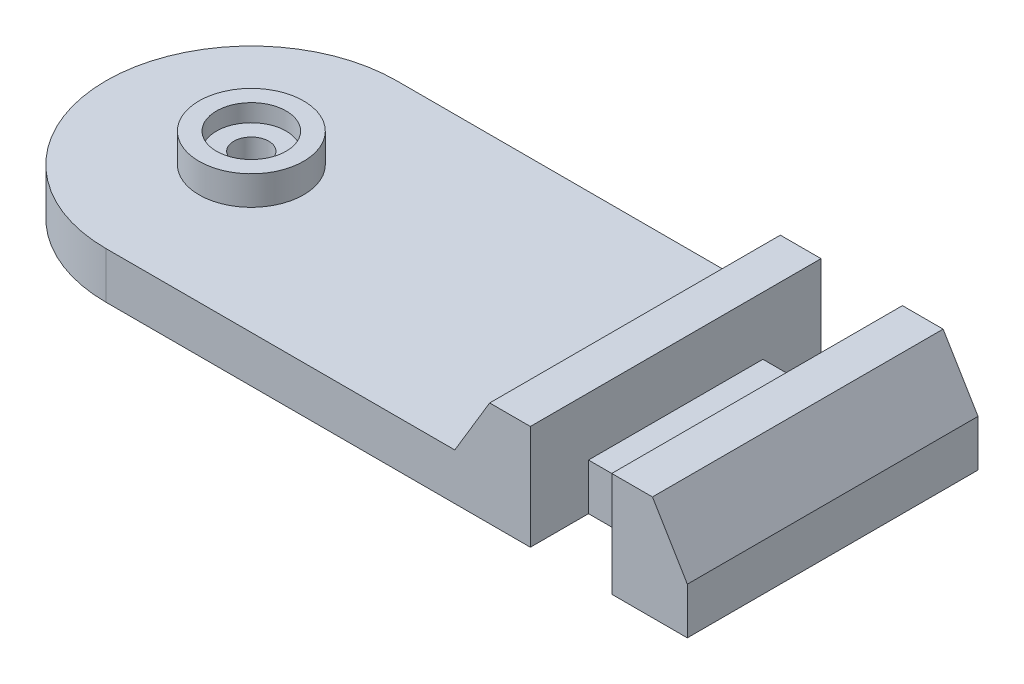
ISO-10303-21;
HEADER;
FILE_DESCRIPTION(('STEP AP214'),'2;1');
FILE_NAME('part.step','',(''),(''),'','','');
FILE_SCHEMA(('AUTOMOTIVE_DESIGN { 1 0 10303 214 1 1 1 1 }'));
ENDSEC;
DATA;
#1=APPLICATION_CONTEXT('core data for automotive mechanical design processes');
#2=APPLICATION_PROTOCOL_DEFINITION('international standard','automotive_design',2000,#1);
#3=PRODUCT_CONTEXT('',#1,'mechanical');
#4=PRODUCT('Part','Part','',(#3));
#5=PRODUCT_RELATED_PRODUCT_CATEGORY('part','',(#4));
#6=PRODUCT_DEFINITION_FORMATION('','',#4);
#7=PRODUCT_DEFINITION_CONTEXT('part definition',#1,'design');
#8=PRODUCT_DEFINITION('design','',#6,#7);
#9=PRODUCT_DEFINITION_SHAPE('','',#8);
#10=(LENGTH_UNIT() NAMED_UNIT(*) SI_UNIT(.MILLI.,.METRE.));
#11=(NAMED_UNIT(*) PLANE_ANGLE_UNIT() SI_UNIT($,.RADIAN.));
#12=(NAMED_UNIT(*) SI_UNIT($,.STERADIAN.) SOLID_ANGLE_UNIT());
#13=UNCERTAINTY_MEASURE_WITH_UNIT(LENGTH_MEASURE(1.E-05),#10,'distance_accuracy_value','');
#14=(GEOMETRIC_REPRESENTATION_CONTEXT(3) GLOBAL_UNCERTAINTY_ASSIGNED_CONTEXT((#13)) GLOBAL_UNIT_ASSIGNED_CONTEXT((#10,
#11,#12)) REPRESENTATION_CONTEXT('',''));
#15=CARTESIAN_POINT('',(0.,0.,0.));
#16=DIRECTION('',(0.,0.,1.));
#17=DIRECTION('',(1.,0.,0.));
#18=AXIS2_PLACEMENT_3D('',#15,#16,#17);
#19=CARTESIAN_POINT('',(0.,4.,12.5));
#20=DIRECTION('',(0.,0.,1.));
#21=DIRECTION('',(1.,0.,0.));
#22=AXIS2_PLACEMENT_3D('',#19,#20,#21);
#23=PLANE('',#22);
#24=DIRECTION('',(-1.,0.,0.));
#25=VECTOR('',#24,1.);
#26=CARTESIAN_POINT('',(0.,0.,12.5));
#27=LINE('',#26,#25);
#28=CARTESIAN_POINT('',(36.5,0.,12.5));
#29=VERTEX_POINT('',#28);
#30=CARTESIAN_POINT('',(0.,0.,12.5));
#31=VERTEX_POINT('',#30);
#32=EDGE_CURVE('E159',#29,#31,#27,.T.);
#33=ORIENTED_EDGE('',*,*,#32,.F.);
#34=DIRECTION('',(0.,-1.,0.));
#35=VECTOR('',#34,1.);
#36=CARTESIAN_POINT('',(36.5,9.,12.5));
#37=LINE('',#36,#35);
#38=CARTESIAN_POINT('',(36.5,9.,12.5));
#39=VERTEX_POINT('',#38);
#40=EDGE_CURVE('E143',#39,#29,#37,.T.);
#41=ORIENTED_EDGE('',*,*,#40,.F.);
#42=DIRECTION('',(-1.,0.,0.));
#43=VECTOR('',#42,1.);
#44=CARTESIAN_POINT('',(33.,9.,12.5));
#45=LINE('',#44,#43);
#46=CARTESIAN_POINT('',(33.,9.,12.5));
#47=VERTEX_POINT('',#46);
#48=EDGE_CURVE('E289',#39,#47,#45,.T.);
#49=ORIENTED_EDGE('',*,*,#48,.T.);
#50=DIRECTION('',(-0.514495755427527,-0.857492925712544,0.));
#51=VECTOR('',#50,1.);
#52=CARTESIAN_POINT('',(33.,9.,12.5));
#53=LINE('',#52,#51);
#54=CARTESIAN_POINT('',(30.,4.,12.5));
#55=VERTEX_POINT('',#54);
#56=EDGE_CURVE('E284',#47,#55,#53,.T.);
#57=ORIENTED_EDGE('',*,*,#56,.T.);
#58=DIRECTION('',(-1.,0.,0.));
#59=VECTOR('',#58,1.);
#60=CARTESIAN_POINT('',(0.,4.,12.5));
#61=LINE('',#60,#59);
#62=CARTESIAN_POINT('',(0.,4.,12.5));
#63=VERTEX_POINT('',#62);
#64=EDGE_CURVE('E190',#55,#63,#61,.T.);
#65=ORIENTED_EDGE('',*,*,#64,.T.);
#66=DIRECTION('',(0.,-1.,0.));
#67=VECTOR('',#66,1.);
#68=CARTESIAN_POINT('',(0.,4.,12.5));
#69=LINE('',#68,#67);
#70=EDGE_CURVE('E167',#63,#31,#69,.T.);
#71=ORIENTED_EDGE('',*,*,#70,.T.);
#72=EDGE_LOOP('',(#33,#41,#49,#57,#65,#71));
#73=FACE_BOUND('',#72,.T.);
#74=ADVANCED_FACE('F37',(#73),#23,.T.);
#75=CARTESIAN_POINT('',(0.,4.,-12.5));
#76=DIRECTION('',(0.,0.,-1.));
#77=DIRECTION('',(-1.,0.,0.));
#78=AXIS2_PLACEMENT_3D('',#75,#76,#77);
#79=PLANE('',#78);
#80=DIRECTION('',(0.,-1.,0.));
#81=VECTOR('',#80,1.);
#82=CARTESIAN_POINT('',(36.5,9.,-12.5));
#83=LINE('',#82,#81);
#84=CARTESIAN_POINT('',(36.5,9.,-12.5));
#85=VERTEX_POINT('',#84);
#86=CARTESIAN_POINT('',(36.5,0.,-12.5));
#87=VERTEX_POINT('',#86);
#88=EDGE_CURVE('E60',#85,#87,#83,.T.);
#89=ORIENTED_EDGE('',*,*,#88,.T.);
#90=DIRECTION('',(1.,0.,0.));
#91=VECTOR('',#90,1.);
#92=CARTESIAN_POINT('',(0.,0.,-12.5));
#93=LINE('',#92,#91);
#94=CARTESIAN_POINT('',(0.,0.,-12.5));
#95=VERTEX_POINT('',#94);
#96=EDGE_CURVE('E182',#95,#87,#93,.T.);
#97=ORIENTED_EDGE('',*,*,#96,.F.);
#98=DIRECTION('',(0.,-1.,0.));
#99=VECTOR('',#98,1.);
#100=CARTESIAN_POINT('',(0.,4.,-12.5));
#101=LINE('',#100,#99);
#102=CARTESIAN_POINT('',(0.,4.,-12.5));
#103=VERTEX_POINT('',#102);
#104=EDGE_CURVE('E192',#103,#95,#101,.T.);
#105=ORIENTED_EDGE('',*,*,#104,.F.);
#106=DIRECTION('',(1.,0.,0.));
#107=VECTOR('',#106,1.);
#108=CARTESIAN_POINT('',(0.,4.,-12.5));
#109=LINE('',#108,#107);
#110=CARTESIAN_POINT('',(30.,4.,-12.5));
#111=VERTEX_POINT('',#110);
#112=EDGE_CURVE('E230',#103,#111,#109,.T.);
#113=ORIENTED_EDGE('',*,*,#112,.T.);
#114=DIRECTION('',(-0.514495755427527,-0.857492925712544,0.));
#115=VECTOR('',#114,1.);
#116=CARTESIAN_POINT('',(33.,9.,-12.5));
#117=LINE('',#116,#115);
#118=CARTESIAN_POINT('',(33.,9.,-12.5));
#119=VERTEX_POINT('',#118);
#120=EDGE_CURVE('E293',#119,#111,#117,.T.);
#121=ORIENTED_EDGE('',*,*,#120,.F.);
#122=DIRECTION('',(-1.,0.,0.));
#123=VECTOR('',#122,1.);
#124=CARTESIAN_POINT('',(33.,9.,-12.5));
#125=LINE('',#124,#123);
#126=EDGE_CURVE('E252',#85,#119,#125,.T.);
#127=ORIENTED_EDGE('',*,*,#126,.F.);
#128=EDGE_LOOP('',(#89,#97,#105,#113,#121,#127));
#129=FACE_BOUND('',#128,.T.);
#130=ADVANCED_FACE('F249',(#129),#79,.T.);
#131=CARTESIAN_POINT('',(33.,9.,-33.1155281280883));
#132=DIRECTION('',(0.,1.,0.));
#133=DIRECTION('',(0.,0.,1.));
#134=AXIS2_PLACEMENT_3D('',#131,#132,#133);
#135=PLANE('',#134);
#136=DIRECTION('',(0.,0.,1.));
#137=VECTOR('',#136,1.);
#138=CARTESIAN_POINT('',(43.5,9.,-12.5));
#139=LINE('',#138,#137);
#140=CARTESIAN_POINT('',(43.5,9.,-12.5));
#141=VERTEX_POINT('',#140);
#142=CARTESIAN_POINT('',(43.5,9.,12.5));
#143=VERTEX_POINT('',#142);
#144=EDGE_CURVE('E253',#141,#143,#139,.T.);
#145=ORIENTED_EDGE('',*,*,#144,.T.);
#146=CARTESIAN_POINT('',(47.,9.,12.5));
#147=VERTEX_POINT('',#146);
#148=EDGE_CURVE('E287',#147,#143,#45,.T.);
#149=ORIENTED_EDGE('',*,*,#148,.F.);
#150=DIRECTION('',(0.,0.,1.));
#151=VECTOR('',#150,1.);
#152=CARTESIAN_POINT('',(47.,9.,-33.1155281280883));
#153=LINE('',#152,#151);
#154=CARTESIAN_POINT('',(47.,9.,-12.5));
#155=VERTEX_POINT('',#154);
#156=EDGE_CURVE('E225',#155,#147,#153,.T.);
#157=ORIENTED_EDGE('',*,*,#156,.F.);
#158=EDGE_CURVE('E222',#155,#141,#125,.T.);
#159=ORIENTED_EDGE('',*,*,#158,.T.);
#160=EDGE_LOOP('',(#145,#149,#157,#159));
#161=FACE_BOUND('',#160,.T.);
#162=ADVANCED_FACE('F327',(#161),#135,.T.);
#163=DIRECTION('',(0.,1.,0.));
#164=VECTOR('',#163,1.);
#165=CARTESIAN_POINT('',(43.5,9.,12.5));
#166=LINE('',#165,#164);
#167=CARTESIAN_POINT('',(43.5,0.,12.5));
#168=VERTEX_POINT('',#167);
#169=EDGE_CURVE('E153',#168,#143,#166,.T.);
#170=ORIENTED_EDGE('',*,*,#169,.F.);
#171=CARTESIAN_POINT('',(50.,0.,12.5));
#172=VERTEX_POINT('',#171);
#173=EDGE_CURVE('E169',#172,#168,#27,.T.);
#174=ORIENTED_EDGE('',*,*,#173,.F.);
#175=DIRECTION('',(0.,-1.,0.));
#176=VECTOR('',#175,1.);
#177=CARTESIAN_POINT('',(50.,4.,12.5));
#178=LINE('',#177,#176);
#179=CARTESIAN_POINT('',(50.,4.,12.5));
#180=VERTEX_POINT('',#179);
#181=EDGE_CURVE('E45',#180,#172,#178,.T.);
#182=ORIENTED_EDGE('',*,*,#181,.F.);
#183=DIRECTION('',(-0.514495755427527,0.857492925712544,0.));
#184=VECTOR('',#183,1.);
#185=CARTESIAN_POINT('',(47.,9.,12.5));
#186=LINE('',#185,#184);
#187=EDGE_CURVE('E229',#180,#147,#186,.T.);
#188=ORIENTED_EDGE('',*,*,#187,.T.);
#189=ORIENTED_EDGE('',*,*,#148,.T.);
#190=EDGE_LOOP('',(#170,#174,#182,#188,#189));
#191=FACE_BOUND('',#190,.T.);
#192=ADVANCED_FACE('F208',(#191),#23,.T.);
#193=CARTESIAN_POINT('',(50.,4.,0.));
#194=DIRECTION('',(1.,0.,0.));
#195=DIRECTION('',(0.,0.,-1.));
#196=AXIS2_PLACEMENT_3D('',#193,#194,#195);
#197=PLANE('',#196);
#198=DIRECTION('',(0.,0.,1.));
#199=VECTOR('',#198,1.);
#200=CARTESIAN_POINT('',(50.,0.,0.));
#201=LINE('',#200,#199);
#202=CARTESIAN_POINT('',(50.,0.,-12.5));
#203=VERTEX_POINT('',#202);
#204=EDGE_CURVE('E173',#203,#172,#201,.T.);
#205=ORIENTED_EDGE('',*,*,#204,.F.);
#206=DIRECTION('',(0.,-1.,0.));
#207=VECTOR('',#206,1.);
#208=CARTESIAN_POINT('',(50.,4.,-12.5));
#209=LINE('',#208,#207);
#210=CARTESIAN_POINT('',(50.,4.,-12.5));
#211=VERTEX_POINT('',#210);
#212=EDGE_CURVE('E195',#211,#203,#209,.T.);
#213=ORIENTED_EDGE('',*,*,#212,.F.);
#214=DIRECTION('',(0.,0.,1.));
#215=VECTOR('',#214,1.);
#216=CARTESIAN_POINT('',(50.,4.,0.));
#217=LINE('',#216,#215);
#218=EDGE_CURVE('E205',#211,#180,#217,.T.);
#219=ORIENTED_EDGE('',*,*,#218,.T.);
#220=ORIENTED_EDGE('',*,*,#181,.T.);
#221=EDGE_LOOP('',(#205,#213,#219,#220));
#222=FACE_BOUND('',#221,.T.);
#223=ADVANCED_FACE('F202',(#222),#197,.T.);
#224=CARTESIAN_POINT('',(43.5,0.,-12.5));
#225=VERTEX_POINT('',#224);
#226=EDGE_CURVE('E181',#225,#203,#93,.T.);
#227=ORIENTED_EDGE('',*,*,#226,.F.);
#228=DIRECTION('',(0.,1.,0.));
#229=VECTOR('',#228,1.);
#230=CARTESIAN_POINT('',(43.5,9.,-12.5));
#231=LINE('',#230,#229);
#232=EDGE_CURVE('E152',#225,#141,#231,.T.);
#233=ORIENTED_EDGE('',*,*,#232,.T.);
#234=ORIENTED_EDGE('',*,*,#158,.F.);
#235=DIRECTION('',(-0.514495755427527,0.857492925712544,0.));
#236=VECTOR('',#235,1.);
#237=CARTESIAN_POINT('',(47.,9.,-12.5));
#238=LINE('',#237,#236);
#239=EDGE_CURVE('E220',#211,#155,#238,.T.);
#240=ORIENTED_EDGE('',*,*,#239,.F.);
#241=ORIENTED_EDGE('',*,*,#212,.T.);
#242=EDGE_LOOP('',(#227,#233,#234,#240,#241));
#243=FACE_BOUND('',#242,.T.);
#244=ADVANCED_FACE('F218',(#243),#79,.T.);
#245=CARTESIAN_POINT('',(0.,4.,0.));
#246=DIRECTION('',(0.,-1.,0.));
#247=DIRECTION('',(0.,0.,-1.));
#248=AXIS2_PLACEMENT_3D('',#245,#246,#247);
#249=CYLINDRICAL_SURFACE('',#248,12.5);
#250=CARTESIAN_POINT('',(0.,0.,0.));
#251=DIRECTION('',(0.,1.,0.));
#252=DIRECTION('',(0.,0.,1.));
#253=AXIS2_PLACEMENT_3D('',#250,#251,#252);
#254=CIRCLE('',#253,12.5);
#255=EDGE_CURVE('E185',#95,#31,#254,.T.);
#256=ORIENTED_EDGE('',*,*,#255,.T.);
#257=ORIENTED_EDGE('',*,*,#70,.F.);
#258=CARTESIAN_POINT('',(0.,4.,0.));
#259=DIRECTION('',(0.,1.,0.));
#260=DIRECTION('',(0.,0.,1.));
#261=AXIS2_PLACEMENT_3D('',#258,#259,#260);
#262=CIRCLE('',#261,12.5);
#263=EDGE_CURVE('E193',#103,#63,#262,.T.);
#264=ORIENTED_EDGE('',*,*,#263,.F.);
#265=ORIENTED_EDGE('',*,*,#104,.T.);
#266=EDGE_LOOP('',(#256,#257,#264,#265));
#267=FACE_BOUND('',#266,.T.);
#268=ADVANCED_FACE('F245',(#267),#249,.T.);
#269=CARTESIAN_POINT('',(40.,4.,0.));
#270=DIRECTION('',(0.,-1.,0.));
#271=DIRECTION('',(0.,0.,-1.));
#272=AXIS2_PLACEMENT_3D('',#269,#270,#271);
#273=CYLINDRICAL_SURFACE('',#272,1.5);
#274=CARTESIAN_POINT('',(40.,4.,0.));
#275=DIRECTION('',(0.,-1.,0.));
#276=DIRECTION('',(0.,0.,-1.));
#277=AXIS2_PLACEMENT_3D('',#274,#275,#276);
#278=CIRCLE('',#277,1.5);
#279=CARTESIAN_POINT('',(40.,4.,-1.5));
#280=VERTEX_POINT('',#279);
#281=EDGE_CURVE('E277',#280,#280,#278,.T.);
#282=ORIENTED_EDGE('',*,*,#281,.F.);
#283=EDGE_LOOP('',(#282));
#284=FACE_BOUND('',#283,.T.);
#285=CARTESIAN_POINT('',(40.,0.,0.));
#286=DIRECTION('',(0.,1.,0.));
#287=DIRECTION('',(0.,0.,1.));
#288=AXIS2_PLACEMENT_3D('',#285,#286,#287);
#289=CIRCLE('',#288,1.5);
#290=CARTESIAN_POINT('',(40.,0.,1.5));
#291=VERTEX_POINT('',#290);
#292=EDGE_CURVE('E170',#291,#291,#289,.T.);
#293=ORIENTED_EDGE('',*,*,#292,.F.);
#294=EDGE_LOOP('',(#293));
#295=FACE_BOUND('',#294,.T.);
#296=ADVANCED_FACE('F39',(#284,#295),#273,.F.);
#297=CARTESIAN_POINT('',(0.,4.,0.));
#298=DIRECTION('',(0.,-1.,0.));
#299=DIRECTION('',(0.,0.,-1.));
#300=AXIS2_PLACEMENT_3D('',#297,#298,#299);
#301=CYLINDRICAL_SURFACE('',#300,1.5);
#302=CARTESIAN_POINT('',(0.,0.,0.));
#303=DIRECTION('',(0.,1.,0.));
#304=DIRECTION('',(0.,0.,1.));
#305=AXIS2_PLACEMENT_3D('',#302,#303,#304);
#306=CIRCLE('',#305,1.5);
#307=CARTESIAN_POINT('',(0.,0.,1.5));
#308=VERTEX_POINT('',#307);
#309=EDGE_CURVE('E187',#308,#308,#306,.T.);
#310=ORIENTED_EDGE('',*,*,#309,.F.);
#311=EDGE_LOOP('',(#310));
#312=FACE_BOUND('',#311,.T.);
#313=CARTESIAN_POINT('',(0.,5.,0.));
#314=DIRECTION('',(0.,1.,0.));
#315=DIRECTION('',(0.,0.,1.));
#316=AXIS2_PLACEMENT_3D('',#313,#314,#315);
#317=CIRCLE('',#316,1.5);
#318=CARTESIAN_POINT('',(0.,5.,1.5));
#319=VERTEX_POINT('',#318);
#320=EDGE_CURVE('E269',#319,#319,#317,.T.);
#321=ORIENTED_EDGE('',*,*,#320,.T.);
#322=EDGE_LOOP('',(#321));
#323=FACE_BOUND('',#322,.T.);
#324=ADVANCED_FACE('F311',(#312,#323),#301,.F.);
#325=CARTESIAN_POINT('',(0.,4.,0.));
#326=DIRECTION('',(0.,1.,0.));
#327=DIRECTION('',(0.,0.,1.));
#328=AXIS2_PLACEMENT_3D('',#325,#326,#327);
#329=PLANE('',#328);
#330=DIRECTION('',(0.,0.,1.));
#331=VECTOR('',#330,1.);
#332=CARTESIAN_POINT('',(30.,4.,-33.1155281280883));
#333=LINE('',#332,#331);
#334=EDGE_CURVE('E226',#111,#55,#333,.T.);
#335=ORIENTED_EDGE('',*,*,#334,.F.);
#336=ORIENTED_EDGE('',*,*,#112,.F.);
#337=ORIENTED_EDGE('',*,*,#263,.T.);
#338=ORIENTED_EDGE('',*,*,#64,.F.);
#339=EDGE_LOOP('',(#335,#336,#337,#338));
#340=FACE_BOUND('',#339,.T.);
#341=CARTESIAN_POINT('',(0.,4.,0.));
#342=DIRECTION('',(0.,1.,0.));
#343=DIRECTION('',(0.,0.,1.));
#344=AXIS2_PLACEMENT_3D('',#341,#342,#343);
#345=CIRCLE('',#344,4.5);
#346=CARTESIAN_POINT('',(0.,4.,4.5));
#347=VERTEX_POINT('',#346);
#348=EDGE_CURVE('E304',#347,#347,#345,.T.);
#349=ORIENTED_EDGE('',*,*,#348,.F.);
#350=EDGE_LOOP('',(#349));
#351=FACE_BOUND('',#350,.T.);
#352=ADVANCED_FACE('F242',(#340,#351),#329,.T.);
#353=CARTESIAN_POINT('',(0.,0.,0.));
#354=DIRECTION('',(0.,1.,0.));
#355=DIRECTION('',(0.,0.,1.));
#356=AXIS2_PLACEMENT_3D('',#353,#354,#355);
#357=PLANE('',#356);
#358=ORIENTED_EDGE('',*,*,#292,.T.);
#359=EDGE_LOOP('',(#358));
#360=FACE_BOUND('',#359,.T.);
#361=DIRECTION('',(-1.,0.,0.));
#362=VECTOR('',#361,1.);
#363=CARTESIAN_POINT('',(43.5,0.,7.5));
#364=LINE('',#363,#362);
#365=CARTESIAN_POINT('',(43.5,0.,7.5));
#366=VERTEX_POINT('',#365);
#367=CARTESIAN_POINT('',(36.5,0.,7.50000000000001));
#368=VERTEX_POINT('',#367);
#369=EDGE_CURVE('E163',#366,#368,#364,.T.);
#370=ORIENTED_EDGE('',*,*,#369,.T.);
#371=DIRECTION('',(0.,0.,1.));
#372=VECTOR('',#371,1.);
#373=CARTESIAN_POINT('',(36.5,0.,7.50000000000001));
#374=LINE('',#373,#372);
#375=EDGE_CURVE('E146',#368,#29,#374,.T.);
#376=ORIENTED_EDGE('',*,*,#375,.T.);
#377=ORIENTED_EDGE('',*,*,#32,.T.);
#378=ORIENTED_EDGE('',*,*,#255,.F.);
#379=ORIENTED_EDGE('',*,*,#96,.T.);
#380=DIRECTION('',(0.,0.,1.));
#381=VECTOR('',#380,1.);
#382=CARTESIAN_POINT('',(36.5,0.,-7.50000000000001));
#383=LINE('',#382,#381);
#384=CARTESIAN_POINT('',(36.5,0.,-7.50000000000001));
#385=VERTEX_POINT('',#384);
#386=EDGE_CURVE('E255',#87,#385,#383,.T.);
#387=ORIENTED_EDGE('',*,*,#386,.T.);
#388=DIRECTION('',(1.,0.,0.));
#389=VECTOR('',#388,1.);
#390=CARTESIAN_POINT('',(43.5,0.,-7.5));
#391=LINE('',#390,#389);
#392=CARTESIAN_POINT('',(43.5,0.,-7.5));
#393=VERTEX_POINT('',#392);
#394=EDGE_CURVE('E262',#385,#393,#391,.T.);
#395=ORIENTED_EDGE('',*,*,#394,.T.);
#396=DIRECTION('',(0.,0.,-1.));
#397=VECTOR('',#396,1.);
#398=CARTESIAN_POINT('',(43.5,0.,-12.5));
#399=LINE('',#398,#397);
#400=EDGE_CURVE('E215',#393,#225,#399,.T.);
#401=ORIENTED_EDGE('',*,*,#400,.T.);
#402=ORIENTED_EDGE('',*,*,#226,.T.);
#403=ORIENTED_EDGE('',*,*,#204,.T.);
#404=ORIENTED_EDGE('',*,*,#173,.T.);
#405=DIRECTION('',(0.,0.,-1.));
#406=VECTOR('',#405,1.);
#407=CARTESIAN_POINT('',(43.5,0.,12.5));
#408=LINE('',#407,#406);
#409=EDGE_CURVE('E164',#168,#366,#408,.T.);
#410=ORIENTED_EDGE('',*,*,#409,.T.);
#411=EDGE_LOOP('',(#370,#376,#377,#378,#379,#387,#395,#401,#402,#403,#404,#410));
#412=FACE_BOUND('',#411,.T.);
#413=ORIENTED_EDGE('',*,*,#309,.T.);
#414=EDGE_LOOP('',(#413));
#415=FACE_BOUND('',#414,.T.);
#416=ADVANCED_FACE('F156',(#360,#412,#415),#357,.F.);
#417=CARTESIAN_POINT('',(0.,6.5,0.));
#418=DIRECTION('',(0.,1.,0.));
#419=DIRECTION('',(0.,0.,1.));
#420=AXIS2_PLACEMENT_3D('',#417,#418,#419);
#421=PLANE('',#420);
#422=CARTESIAN_POINT('',(0.,6.5,0.));
#423=DIRECTION('',(0.,1.,0.));
#424=DIRECTION('',(0.,0.,1.));
#425=AXIS2_PLACEMENT_3D('',#422,#423,#424);
#426=CIRCLE('',#425,4.5);
#427=CARTESIAN_POINT('',(0.,6.5,4.5));
#428=VERTEX_POINT('',#427);
#429=EDGE_CURVE('E175',#428,#428,#426,.T.);
#430=ORIENTED_EDGE('',*,*,#429,.T.);
#431=EDGE_LOOP('',(#430));
#432=FACE_BOUND('',#431,.T.);
#433=CARTESIAN_POINT('',(0.,6.5,0.));
#434=DIRECTION('',(0.,1.,0.));
#435=DIRECTION('',(0.,0.,1.));
#436=AXIS2_PLACEMENT_3D('',#433,#434,#435);
#437=CIRCLE('',#436,3.);
#438=CARTESIAN_POINT('',(0.,6.5,3.));
#439=VERTEX_POINT('',#438);
#440=EDGE_CURVE('E299',#439,#439,#437,.T.);
#441=ORIENTED_EDGE('',*,*,#440,.F.);
#442=EDGE_LOOP('',(#441));
#443=FACE_BOUND('',#442,.T.);
#444=ADVANCED_FACE('F317',(#432,#443),#421,.T.);
#445=CARTESIAN_POINT('',(0.,6.5,0.));
#446=DIRECTION('',(0.,-1.,0.));
#447=DIRECTION('',(0.,0.,-1.));
#448=AXIS2_PLACEMENT_3D('',#445,#446,#447);
#449=CYLINDRICAL_SURFACE('',#448,4.5);
#450=ORIENTED_EDGE('',*,*,#429,.F.);
#451=EDGE_LOOP('',(#450));
#452=FACE_BOUND('',#451,.T.);
#453=ORIENTED_EDGE('',*,*,#348,.T.);
#454=EDGE_LOOP('',(#453));
#455=FACE_BOUND('',#454,.T.);
#456=ADVANCED_FACE('F309',(#452,#455),#449,.T.);
#457=CARTESIAN_POINT('',(0.,6.5,0.));
#458=DIRECTION('',(0.,-1.,0.));
#459=DIRECTION('',(0.,0.,-1.));
#460=AXIS2_PLACEMENT_3D('',#457,#458,#459);
#461=CYLINDRICAL_SURFACE('',#460,3.);
#462=CARTESIAN_POINT('',(0.,5.,0.));
#463=DIRECTION('',(0.,1.,0.));
#464=DIRECTION('',(0.,0.,1.));
#465=AXIS2_PLACEMENT_3D('',#462,#463,#464);
#466=CIRCLE('',#465,3.);
#467=CARTESIAN_POINT('',(0.,5.,3.));
#468=VERTEX_POINT('',#467);
#469=EDGE_CURVE('E11',#468,#468,#466,.T.);
#470=ORIENTED_EDGE('',*,*,#469,.F.);
#471=EDGE_LOOP('',(#470));
#472=FACE_BOUND('',#471,.T.);
#473=ORIENTED_EDGE('',*,*,#440,.T.);
#474=EDGE_LOOP('',(#473));
#475=FACE_BOUND('',#474,.T.);
#476=ADVANCED_FACE('F359',(#472,#475),#461,.F.);
#477=CARTESIAN_POINT('',(47.,9.,-33.1155281280883));
#478=DIRECTION('',(0.857492925712544,0.514495755427527,0.));
#479=DIRECTION('',(-0.514495755427527,0.857492925712544,0.));
#480=AXIS2_PLACEMENT_3D('',#477,#478,#479);
#481=PLANE('',#480);
#482=ORIENTED_EDGE('',*,*,#218,.F.);
#483=ORIENTED_EDGE('',*,*,#239,.T.);
#484=ORIENTED_EDGE('',*,*,#156,.T.);
#485=ORIENTED_EDGE('',*,*,#187,.F.);
#486=EDGE_LOOP('',(#482,#483,#484,#485));
#487=FACE_BOUND('',#486,.T.);
#488=ADVANCED_FACE('F228',(#487),#481,.T.);
#489=CARTESIAN_POINT('',(33.,9.,-33.1155281280883));
#490=DIRECTION('',(-0.857492925712544,0.514495755427527,0.));
#491=DIRECTION('',(-0.514495755427527,-0.857492925712544,0.));
#492=AXIS2_PLACEMENT_3D('',#489,#490,#491);
#493=PLANE('',#492);
#494=DIRECTION('',(0.,0.,1.));
#495=VECTOR('',#494,1.);
#496=CARTESIAN_POINT('',(33.,9.,-33.1155281280883));
#497=LINE('',#496,#495);
#498=EDGE_CURVE('E291',#119,#47,#497,.T.);
#499=ORIENTED_EDGE('',*,*,#498,.F.);
#500=ORIENTED_EDGE('',*,*,#120,.T.);
#501=ORIENTED_EDGE('',*,*,#334,.T.);
#502=ORIENTED_EDGE('',*,*,#56,.F.);
#503=EDGE_LOOP('',(#499,#500,#501,#502));
#504=FACE_BOUND('',#503,.T.);
#505=ADVANCED_FACE('F344',(#504),#493,.T.);
#506=DIRECTION('',(0.,0.,1.));
#507=VECTOR('',#506,1.);
#508=CARTESIAN_POINT('',(36.5,9.,-12.5));
#509=LINE('',#508,#507);
#510=EDGE_CURVE('E148',#85,#39,#509,.T.);
#511=ORIENTED_EDGE('',*,*,#510,.F.);
#512=ORIENTED_EDGE('',*,*,#126,.T.);
#513=ORIENTED_EDGE('',*,*,#498,.T.);
#514=ORIENTED_EDGE('',*,*,#48,.F.);
#515=EDGE_LOOP('',(#511,#512,#513,#514));
#516=FACE_BOUND('',#515,.T.);
#517=ADVANCED_FACE('F337',(#516),#135,.T.);
#518=CARTESIAN_POINT('',(43.5,9.,-12.5));
#519=DIRECTION('',(1.,0.,0.));
#520=DIRECTION('',(0.,0.,-1.));
#521=AXIS2_PLACEMENT_3D('',#518,#519,#520);
#522=PLANE('',#521);
#523=ORIENTED_EDGE('',*,*,#169,.T.);
#524=ORIENTED_EDGE('',*,*,#144,.F.);
#525=ORIENTED_EDGE('',*,*,#232,.F.);
#526=ORIENTED_EDGE('',*,*,#400,.F.);
#527=DIRECTION('',(0.,1.,0.));
#528=VECTOR('',#527,1.);
#529=CARTESIAN_POINT('',(43.5,0.,-7.5));
#530=LINE('',#529,#528);
#531=CARTESIAN_POINT('',(43.5,4.,-7.5));
#532=VERTEX_POINT('',#531);
#533=EDGE_CURVE('E259',#393,#532,#530,.T.);
#534=ORIENTED_EDGE('',*,*,#533,.T.);
#535=DIRECTION('',(0.,0.,1.));
#536=VECTOR('',#535,1.);
#537=CARTESIAN_POINT('',(43.5,4.,-12.5));
#538=LINE('',#537,#536);
#539=CARTESIAN_POINT('',(43.5,4.,7.5));
#540=VERTEX_POINT('',#539);
#541=EDGE_CURVE('E274',#532,#540,#538,.T.);
#542=ORIENTED_EDGE('',*,*,#541,.T.);
#543=DIRECTION('',(0.,1.,0.));
#544=VECTOR('',#543,1.);
#545=CARTESIAN_POINT('',(43.5,0.,7.5));
#546=LINE('',#545,#544);
#547=EDGE_CURVE('E388',#366,#540,#546,.T.);
#548=ORIENTED_EDGE('',*,*,#547,.F.);
#549=ORIENTED_EDGE('',*,*,#409,.F.);
#550=EDGE_LOOP('',(#523,#524,#525,#526,#534,#542,#548,#549));
#551=FACE_BOUND('',#550,.T.);
#552=ADVANCED_FACE('F343',(#551),#522,.F.);
#553=CARTESIAN_POINT('',(43.5,4.,-12.5));
#554=DIRECTION('',(0.,-1.,0.));
#555=DIRECTION('',(1.,0.,0.));
#556=AXIS2_PLACEMENT_3D('',#553,#554,#555);
#557=PLANE('',#556);
#558=ORIENTED_EDGE('',*,*,#281,.T.);
#559=EDGE_LOOP('',(#558));
#560=FACE_BOUND('',#559,.T.);
#561=DIRECTION('',(0.,0.,1.));
#562=VECTOR('',#561,1.);
#563=CARTESIAN_POINT('',(36.5,4.,-12.5));
#564=LINE('',#563,#562);
#565=CARTESIAN_POINT('',(36.5,4.,-7.50000000000001));
#566=VERTEX_POINT('',#565);
#567=CARTESIAN_POINT('',(36.5,4.,7.50000000000001));
#568=VERTEX_POINT('',#567);
#569=EDGE_CURVE('E278',#566,#568,#564,.T.);
#570=ORIENTED_EDGE('',*,*,#569,.T.);
#571=DIRECTION('',(-1.,0.,0.));
#572=VECTOR('',#571,1.);
#573=CARTESIAN_POINT('',(43.5,4.,7.5));
#574=LINE('',#573,#572);
#575=EDGE_CURVE('E52',#540,#568,#574,.T.);
#576=ORIENTED_EDGE('',*,*,#575,.F.);
#577=ORIENTED_EDGE('',*,*,#541,.F.);
#578=DIRECTION('',(1.,0.,0.));
#579=VECTOR('',#578,1.);
#580=CARTESIAN_POINT('',(43.5,4.,-7.5));
#581=LINE('',#580,#579);
#582=EDGE_CURVE('E266',#566,#532,#581,.T.);
#583=ORIENTED_EDGE('',*,*,#582,.F.);
#584=EDGE_LOOP('',(#570,#576,#577,#583));
#585=FACE_BOUND('',#584,.T.);
#586=ADVANCED_FACE('F350',(#560,#585),#557,.F.);
#587=CARTESIAN_POINT('',(36.5,9.,-12.5));
#588=DIRECTION('',(-1.,0.,0.));
#589=DIRECTION('',(0.,0.,1.));
#590=AXIS2_PLACEMENT_3D('',#587,#588,#589);
#591=PLANE('',#590);
#592=ORIENTED_EDGE('',*,*,#40,.T.);
#593=ORIENTED_EDGE('',*,*,#375,.F.);
#594=DIRECTION('',(0.,1.,0.));
#595=VECTOR('',#594,1.);
#596=CARTESIAN_POINT('',(36.5,0.,7.50000000000001));
#597=LINE('',#596,#595);
#598=EDGE_CURVE('E272',#368,#568,#597,.T.);
#599=ORIENTED_EDGE('',*,*,#598,.T.);
#600=ORIENTED_EDGE('',*,*,#569,.F.);
#601=DIRECTION('',(0.,1.,0.));
#602=VECTOR('',#601,1.);
#603=CARTESIAN_POINT('',(36.5,0.,-7.50000000000001));
#604=LINE('',#603,#602);
#605=EDGE_CURVE('E257',#385,#566,#604,.T.);
#606=ORIENTED_EDGE('',*,*,#605,.F.);
#607=ORIENTED_EDGE('',*,*,#386,.F.);
#608=ORIENTED_EDGE('',*,*,#88,.F.);
#609=ORIENTED_EDGE('',*,*,#510,.T.);
#610=EDGE_LOOP('',(#592,#593,#599,#600,#606,#607,#608,#609));
#611=FACE_BOUND('',#610,.T.);
#612=ADVANCED_FACE('F145',(#611),#591,.F.);
#613=CARTESIAN_POINT('',(43.5,0.,-7.5));
#614=DIRECTION('',(0.,0.,1.));
#615=DIRECTION('',(1.,0.,0.));
#616=AXIS2_PLACEMENT_3D('',#613,#614,#615);
#617=PLANE('',#616);
#618=ORIENTED_EDGE('',*,*,#582,.T.);
#619=ORIENTED_EDGE('',*,*,#533,.F.);
#620=ORIENTED_EDGE('',*,*,#394,.F.);
#621=ORIENTED_EDGE('',*,*,#605,.T.);
#622=EDGE_LOOP('',(#618,#619,#620,#621));
#623=FACE_BOUND('',#622,.T.);
#624=ADVANCED_FACE('F364',(#623),#617,.F.);
#625=CARTESIAN_POINT('',(43.5,0.,7.5));
#626=DIRECTION('',(0.,0.,-1.));
#627=DIRECTION('',(-1.,0.,0.));
#628=AXIS2_PLACEMENT_3D('',#625,#626,#627);
#629=PLANE('',#628);
#630=ORIENTED_EDGE('',*,*,#575,.T.);
#631=ORIENTED_EDGE('',*,*,#598,.F.);
#632=ORIENTED_EDGE('',*,*,#369,.F.);
#633=ORIENTED_EDGE('',*,*,#547,.T.);
#634=EDGE_LOOP('',(#630,#631,#632,#633));
#635=FACE_BOUND('',#634,.T.);
#636=ADVANCED_FACE('F370',(#635),#629,.F.);
#637=CARTESIAN_POINT('',(0.,5.,0.));
#638=DIRECTION('',(0.,1.,0.));
#639=DIRECTION('',(0.,0.,1.));
#640=AXIS2_PLACEMENT_3D('',#637,#638,#639);
#641=PLANE('',#640);
#642=ORIENTED_EDGE('',*,*,#469,.T.);
#643=EDGE_LOOP('',(#642));
#644=FACE_BOUND('',#643,.T.);
#645=ORIENTED_EDGE('',*,*,#320,.F.);
#646=EDGE_LOOP('',(#645));
#647=FACE_BOUND('',#646,.T.);
#648=ADVANCED_FACE('F374',(#644,#647),#641,.T.);
#649=CLOSED_SHELL('',(#74,#130,#162,#192,#223,#244,#268,#296,#324,#352,#416,#444,#456,#476,#488,
#505,#517,#552,#586,#612,#624,#636,#648));
#650=MANIFOLD_SOLID_BREP('B2',#649);
#651=ADVANCED_BREP_SHAPE_REPRESENTATION('',(#18,#650),#14);
#652=SHAPE_DEFINITION_REPRESENTATION(#9,#651);
ENDSEC;
END-ISO-10303-21;
